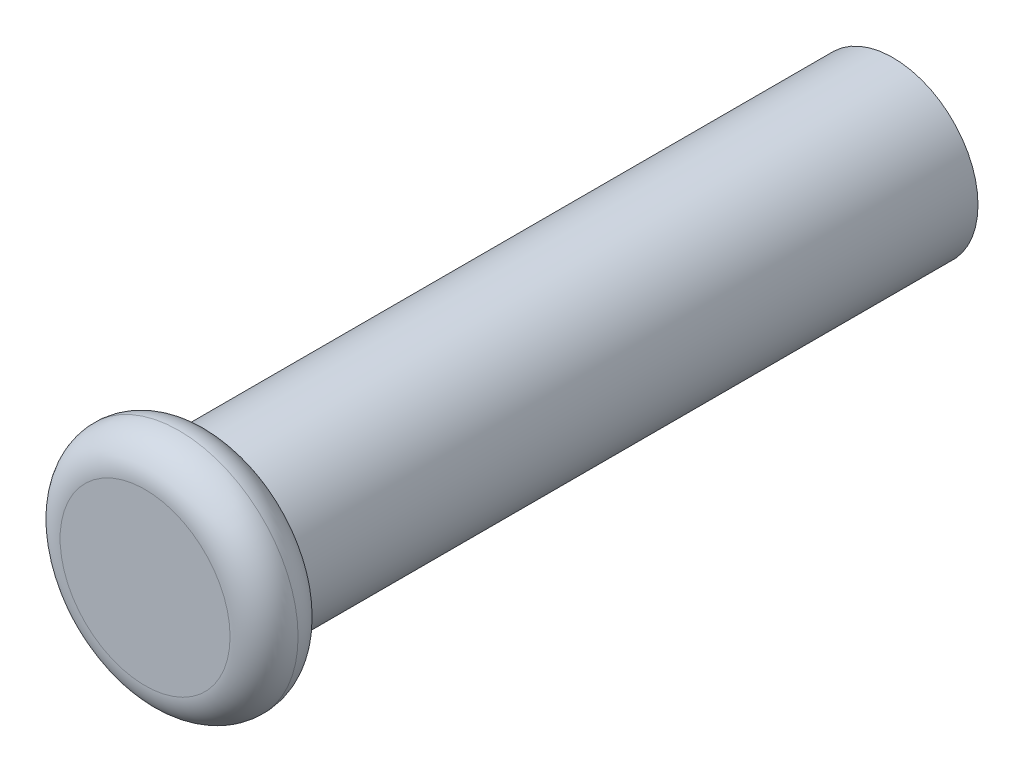
ISO-10303-21;
HEADER;
FILE_DESCRIPTION(('STEP AP214'),'2;1');
FILE_NAME('part.step','',(''),(''),'','','');
FILE_SCHEMA(('AUTOMOTIVE_DESIGN { 1 0 10303 214 1 1 1 1 }'));
ENDSEC;
DATA;
#1=APPLICATION_CONTEXT('core data for automotive mechanical design processes');
#2=APPLICATION_PROTOCOL_DEFINITION('international standard','automotive_design',2000,#1);
#3=PRODUCT_CONTEXT('',#1,'mechanical');
#4=PRODUCT('Part','Part','',(#3));
#5=PRODUCT_RELATED_PRODUCT_CATEGORY('part','',(#4));
#6=PRODUCT_DEFINITION_FORMATION('','',#4);
#7=PRODUCT_DEFINITION_CONTEXT('part definition',#1,'design');
#8=PRODUCT_DEFINITION('design','',#6,#7);
#9=PRODUCT_DEFINITION_SHAPE('','',#8);
#10=(LENGTH_UNIT() NAMED_UNIT(*) SI_UNIT(.MILLI.,.METRE.));
#11=(NAMED_UNIT(*) PLANE_ANGLE_UNIT() SI_UNIT($,.RADIAN.));
#12=(NAMED_UNIT(*) SI_UNIT($,.STERADIAN.) SOLID_ANGLE_UNIT());
#13=UNCERTAINTY_MEASURE_WITH_UNIT(LENGTH_MEASURE(1.E-05),#10,'distance_accuracy_value','');
#14=(GEOMETRIC_REPRESENTATION_CONTEXT(3) GLOBAL_UNCERTAINTY_ASSIGNED_CONTEXT((#13)) GLOBAL_UNIT_ASSIGNED_CONTEXT((#10,
#11,#12)) REPRESENTATION_CONTEXT('',''));
#15=CARTESIAN_POINT('',(0.,0.,0.));
#16=DIRECTION('',(0.,0.,1.));
#17=DIRECTION('',(1.,0.,0.));
#18=AXIS2_PLACEMENT_3D('',#15,#16,#17);
#19=CARTESIAN_POINT('',(0.,0.,20.));
#20=DIRECTION('',(0.,0.,-1.));
#21=DIRECTION('',(-1.,0.,0.));
#22=AXIS2_PLACEMENT_3D('',#19,#20,#21);
#23=CYLINDRICAL_SURFACE('',#22,2.5);
#24=CARTESIAN_POINT('',(0.,0.,20.));
#25=DIRECTION('',(0.,0.,1.));
#26=DIRECTION('',(1.,0.,0.));
#27=AXIS2_PLACEMENT_3D('',#24,#25,#26);
#28=CIRCLE('',#27,2.5);
#29=CARTESIAN_POINT('',(2.5,0.,20.));
#30=VERTEX_POINT('',#29);
#31=EDGE_CURVE('E46',#30,#30,#28,.T.);
#32=ORIENTED_EDGE('',*,*,#31,.F.);
#33=EDGE_LOOP('',(#32));
#34=FACE_BOUND('',#33,.T.);
#35=CARTESIAN_POINT('',(0.,0.,0.));
#36=DIRECTION('',(0.,0.,1.));
#37=DIRECTION('',(1.,0.,0.));
#38=AXIS2_PLACEMENT_3D('',#35,#36,#37);
#39=CIRCLE('',#38,2.5);
#40=CARTESIAN_POINT('',(2.5,0.,0.));
#41=VERTEX_POINT('',#40);
#42=EDGE_CURVE('E51',#41,#41,#39,.T.);
#43=ORIENTED_EDGE('',*,*,#42,.T.);
#44=EDGE_LOOP('',(#43));
#45=FACE_BOUND('',#44,.T.);
#46=ADVANCED_FACE('F37',(#34,#45),#23,.T.);
#47=CARTESIAN_POINT('',(0.,0.,0.));
#48=DIRECTION('',(0.,0.,1.));
#49=DIRECTION('',(1.,0.,0.));
#50=AXIS2_PLACEMENT_3D('',#47,#48,#49);
#51=PLANE('',#50);
#52=ORIENTED_EDGE('',*,*,#42,.F.);
#53=EDGE_LOOP('',(#52));
#54=FACE_BOUND('',#53,.T.);
#55=ADVANCED_FACE('F72',(#54),#51,.F.);
#56=CARTESIAN_POINT('',(0.,0.,22.));
#57=DIRECTION('',(0.,0.,1.));
#58=DIRECTION('',(1.,0.,0.));
#59=AXIS2_PLACEMENT_3D('',#56,#57,#58);
#60=PLANE('',#59);
#61=CARTESIAN_POINT('',(0.,0.,22.));
#62=DIRECTION('',(0.,0.,1.));
#63=DIRECTION('',(1.,0.,0.));
#64=AXIS2_PLACEMENT_3D('',#61,#62,#63);
#65=CIRCLE('',#64,2.5);
#66=CARTESIAN_POINT('',(2.5,0.,22.));
#67=VERTEX_POINT('',#66);
#68=EDGE_CURVE('E10',#67,#67,#65,.T.);
#69=ORIENTED_EDGE('',*,*,#68,.T.);
#70=EDGE_LOOP('',(#69));
#71=FACE_BOUND('',#70,.T.);
#72=ADVANCED_FACE('F66',(#71),#60,.T.);
#73=CARTESIAN_POINT('',(0.,0.,21.));
#74=DIRECTION('',(0.,0.,1.));
#75=DIRECTION('',(1.,0.,0.));
#76=AXIS2_PLACEMENT_3D('',#73,#74,#75);
#77=TOROIDAL_SURFACE('',#76,2.5,1.);
#78=ORIENTED_EDGE('',*,*,#31,.T.);
#79=EDGE_LOOP('',(#78));
#80=FACE_BOUND('',#79,.T.);
#81=CARTESIAN_POINT('',(0.,0.,21.));
#82=DIRECTION('',(0.,0.,1.));
#83=DIRECTION('',(1.,0.,0.));
#84=AXIS2_PLACEMENT_3D('',#81,#82,#83);
#85=CIRCLE('',#84,3.5);
#86=CARTESIAN_POINT('',(3.5,0.,21.));
#87=VERTEX_POINT('',#86);
#88=EDGE_CURVE('E41',#87,#87,#85,.T.);
#89=ORIENTED_EDGE('',*,*,#88,.F.);
#90=EDGE_LOOP('',(#89));
#91=FACE_BOUND('',#90,.T.);
#92=ADVANCED_FACE('F39',(#80,#91),#77,.T.);
#93=CARTESIAN_POINT('',(0.,0.,21.));
#94=DIRECTION('',(0.,0.,1.));
#95=DIRECTION('',(1.,0.,0.));
#96=AXIS2_PLACEMENT_3D('',#93,#94,#95);
#97=TOROIDAL_SURFACE('',#96,2.5,1.);
#98=ORIENTED_EDGE('',*,*,#88,.T.);
#99=EDGE_LOOP('',(#98));
#100=FACE_BOUND('',#99,.T.);
#101=ORIENTED_EDGE('',*,*,#68,.F.);
#102=EDGE_LOOP('',(#101));
#103=FACE_BOUND('',#102,.T.);
#104=ADVANCED_FACE('F62',(#100,#103),#97,.T.);
#105=CLOSED_SHELL('',(#46,#55,#72,#92,#104));
#106=MANIFOLD_SOLID_BREP('B2',#105);
#107=ADVANCED_BREP_SHAPE_REPRESENTATION('',(#18,#106),#14);
#108=SHAPE_DEFINITION_REPRESENTATION(#9,#107);
ENDSEC;
END-ISO-10303-21;
